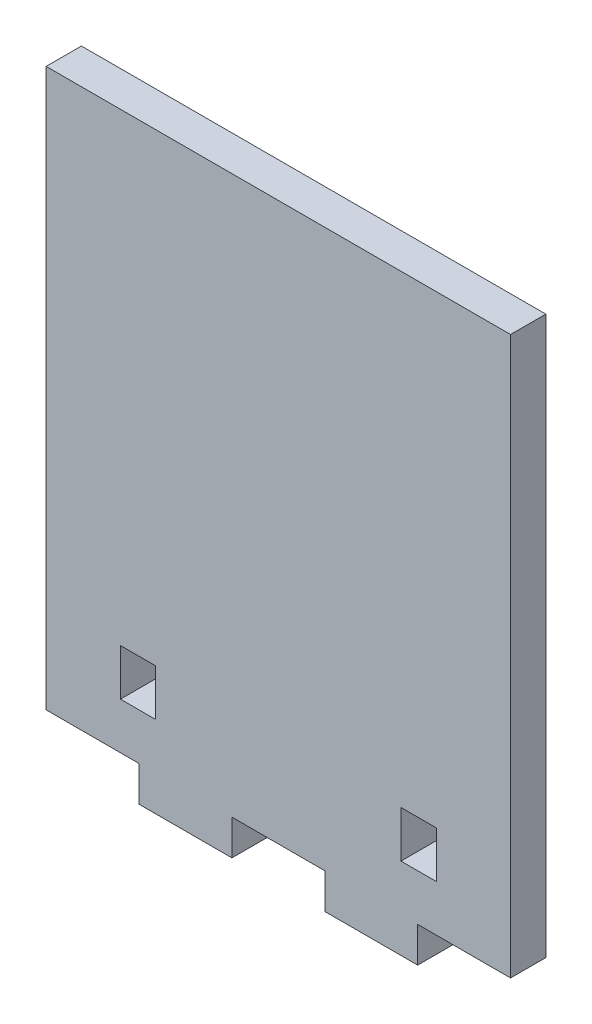
ISO-10303-21;
HEADER;
FILE_DESCRIPTION(('STEP AP214'),'2;1');
FILE_NAME('part.step','',(''),(''),'','','');
FILE_SCHEMA(('AUTOMOTIVE_DESIGN { 1 0 10303 214 1 1 1 1 }'));
ENDSEC;
DATA;
#1=APPLICATION_CONTEXT('core data for automotive mechanical design processes');
#2=APPLICATION_PROTOCOL_DEFINITION('international standard','automotive_design',2000,#1);
#3=PRODUCT_CONTEXT('',#1,'mechanical');
#4=PRODUCT('Part','Part','',(#3));
#5=PRODUCT_RELATED_PRODUCT_CATEGORY('part','',(#4));
#6=PRODUCT_DEFINITION_FORMATION('','',#4);
#7=PRODUCT_DEFINITION_CONTEXT('part definition',#1,'design');
#8=PRODUCT_DEFINITION('design','',#6,#7);
#9=PRODUCT_DEFINITION_SHAPE('','',#8);
#10=(LENGTH_UNIT() NAMED_UNIT(*) SI_UNIT(.MILLI.,.METRE.));
#11=(NAMED_UNIT(*) PLANE_ANGLE_UNIT() SI_UNIT($,.RADIAN.));
#12=(NAMED_UNIT(*) SI_UNIT($,.STERADIAN.) SOLID_ANGLE_UNIT());
#13=UNCERTAINTY_MEASURE_WITH_UNIT(LENGTH_MEASURE(1.E-05),#10,'distance_accuracy_value','');
#14=(GEOMETRIC_REPRESENTATION_CONTEXT(3) GLOBAL_UNCERTAINTY_ASSIGNED_CONTEXT((#13)) GLOBAL_UNIT_ASSIGNED_CONTEXT((#10,
#11,#12)) REPRESENTATION_CONTEXT('',''));
#15=CARTESIAN_POINT('',(0.,0.,0.));
#16=DIRECTION('',(0.,0.,1.));
#17=DIRECTION('',(1.,0.,0.));
#18=AXIS2_PLACEMENT_3D('',#15,#16,#17);
#19=CARTESIAN_POINT('',(0.,0.,4.826));
#20=DIRECTION('',(0.,1.,0.));
#21=DIRECTION('',(0.,0.,1.));
#22=AXIS2_PLACEMENT_3D('',#19,#20,#21);
#23=PLANE('',#22);
#24=DIRECTION('',(1.,0.,0.));
#25=VECTOR('',#24,1.);
#26=CARTESIAN_POINT('',(0.,0.,0.));
#27=LINE('',#26,#25);
#28=CARTESIAN_POINT('',(12.7,0.,0.));
#29=VERTEX_POINT('',#28);
#30=CARTESIAN_POINT('',(25.4,0.,0.));
#31=VERTEX_POINT('',#30);
#32=EDGE_CURVE('E313',#29,#31,#27,.T.);
#33=ORIENTED_EDGE('',*,*,#32,.T.);
#34=DIRECTION('',(0.,0.,1.));
#35=VECTOR('',#34,1.);
#36=CARTESIAN_POINT('',(25.4,0.,0.));
#37=LINE('',#36,#35);
#38=CARTESIAN_POINT('',(25.4,0.,4.826));
#39=VERTEX_POINT('',#38);
#40=EDGE_CURVE('E264',#31,#39,#37,.T.);
#41=ORIENTED_EDGE('',*,*,#40,.T.);
#42=DIRECTION('',(1.,0.,0.));
#43=VECTOR('',#42,1.);
#44=CARTESIAN_POINT('',(0.,0.,4.826));
#45=LINE('',#44,#43);
#46=CARTESIAN_POINT('',(12.7,0.,4.826));
#47=VERTEX_POINT('',#46);
#48=EDGE_CURVE('E303',#47,#39,#45,.T.);
#49=ORIENTED_EDGE('',*,*,#48,.F.);
#50=DIRECTION('',(0.,0.,1.));
#51=VECTOR('',#50,1.);
#52=CARTESIAN_POINT('',(12.7,0.,0.));
#53=LINE('',#52,#51);
#54=EDGE_CURVE('E287',#29,#47,#53,.T.);
#55=ORIENTED_EDGE('',*,*,#54,.F.);
#56=EDGE_LOOP('',(#33,#41,#49,#55));
#57=FACE_BOUND('',#56,.T.);
#58=ADVANCED_FACE('F33',(#57),#23,.F.);
#59=CARTESIAN_POINT('',(0.,0.,4.826));
#60=DIRECTION('',(1.,0.,0.));
#61=DIRECTION('',(0.,0.,-1.));
#62=AXIS2_PLACEMENT_3D('',#59,#60,#61);
#63=PLANE('',#62);
#64=DIRECTION('',(0.,-1.,0.));
#65=VECTOR('',#64,1.);
#66=CARTESIAN_POINT('',(0.,0.,0.));
#67=LINE('',#66,#65);
#68=CARTESIAN_POINT('',(0.,81.026,0.));
#69=VERTEX_POINT('',#68);
#70=CARTESIAN_POINT('',(0.,4.826,0.));
#71=VERTEX_POINT('',#70);
#72=EDGE_CURVE('E294',#69,#71,#67,.T.);
#73=ORIENTED_EDGE('',*,*,#72,.T.);
#74=DIRECTION('',(0.,0.,1.));
#75=VECTOR('',#74,1.);
#76=CARTESIAN_POINT('',(0.,4.826,0.));
#77=LINE('',#76,#75);
#78=CARTESIAN_POINT('',(0.,4.826,4.826));
#79=VERTEX_POINT('',#78);
#80=EDGE_CURVE('E291',#71,#79,#77,.T.);
#81=ORIENTED_EDGE('',*,*,#80,.T.);
#82=DIRECTION('',(0.,-1.,0.));
#83=VECTOR('',#82,1.);
#84=CARTESIAN_POINT('',(0.,0.,4.826));
#85=LINE('',#84,#83);
#86=CARTESIAN_POINT('',(0.,81.026,4.826));
#87=VERTEX_POINT('',#86);
#88=EDGE_CURVE('E298',#87,#79,#85,.T.);
#89=ORIENTED_EDGE('',*,*,#88,.F.);
#90=DIRECTION('',(0.,0.,-1.));
#91=VECTOR('',#90,1.);
#92=CARTESIAN_POINT('',(0.,81.026,4.826));
#93=LINE('',#92,#91);
#94=EDGE_CURVE('E41',#87,#69,#93,.T.);
#95=ORIENTED_EDGE('',*,*,#94,.T.);
#96=EDGE_LOOP('',(#73,#81,#89,#95));
#97=FACE_BOUND('',#96,.T.);
#98=ADVANCED_FACE('F35',(#97),#63,.F.);
#99=CARTESIAN_POINT('',(38.1,0.,0.));
#100=VERTEX_POINT('',#99);
#101=CARTESIAN_POINT('',(50.8,0.,0.));
#102=VERTEX_POINT('',#101);
#103=EDGE_CURVE('E312',#100,#102,#27,.T.);
#104=ORIENTED_EDGE('',*,*,#103,.T.);
#105=DIRECTION('',(0.,0.,1.));
#106=VECTOR('',#105,1.);
#107=CARTESIAN_POINT('',(50.8,0.,0.));
#108=LINE('',#107,#106);
#109=CARTESIAN_POINT('',(50.8,0.,4.826));
#110=VERTEX_POINT('',#109);
#111=EDGE_CURVE('E247',#102,#110,#108,.T.);
#112=ORIENTED_EDGE('',*,*,#111,.T.);
#113=CARTESIAN_POINT('',(38.1,0.,4.826));
#114=VERTEX_POINT('',#113);
#115=EDGE_CURVE('E301',#114,#110,#45,.T.);
#116=ORIENTED_EDGE('',*,*,#115,.F.);
#117=DIRECTION('',(0.,0.,1.));
#118=VECTOR('',#117,1.);
#119=CARTESIAN_POINT('',(38.1,0.,0.));
#120=LINE('',#119,#118);
#121=EDGE_CURVE('E276',#100,#114,#120,.T.);
#122=ORIENTED_EDGE('',*,*,#121,.F.);
#123=EDGE_LOOP('',(#104,#112,#116,#122));
#124=FACE_BOUND('',#123,.T.);
#125=ADVANCED_FACE('F358',(#124),#23,.F.);
#126=CARTESIAN_POINT('',(63.5,0.,4.826));
#127=DIRECTION('',(-1.,0.,0.));
#128=DIRECTION('',(0.,-1.,0.));
#129=AXIS2_PLACEMENT_3D('',#126,#127,#128);
#130=PLANE('',#129);
#131=DIRECTION('',(0.,1.,0.));
#132=VECTOR('',#131,1.);
#133=CARTESIAN_POINT('',(63.5,0.,4.826));
#134=LINE('',#133,#132);
#135=CARTESIAN_POINT('',(63.5,4.826,4.826));
#136=VERTEX_POINT('',#135);
#137=CARTESIAN_POINT('',(63.5,81.026,4.826));
#138=VERTEX_POINT('',#137);
#139=EDGE_CURVE('E306',#136,#138,#134,.T.);
#140=ORIENTED_EDGE('',*,*,#139,.F.);
#141=DIRECTION('',(0.,0.,1.));
#142=VECTOR('',#141,1.);
#143=CARTESIAN_POINT('',(63.5,4.826,0.));
#144=LINE('',#143,#142);
#145=CARTESIAN_POINT('',(63.5,4.826,0.));
#146=VERTEX_POINT('',#145);
#147=EDGE_CURVE('E243',#146,#136,#144,.T.);
#148=ORIENTED_EDGE('',*,*,#147,.F.);
#149=DIRECTION('',(0.,1.,0.));
#150=VECTOR('',#149,1.);
#151=CARTESIAN_POINT('',(63.5,0.,0.));
#152=LINE('',#151,#150);
#153=CARTESIAN_POINT('',(63.5,81.026,0.));
#154=VERTEX_POINT('',#153);
#155=EDGE_CURVE('E316',#146,#154,#152,.T.);
#156=ORIENTED_EDGE('',*,*,#155,.T.);
#157=DIRECTION('',(0.,0.,-1.));
#158=VECTOR('',#157,1.);
#159=CARTESIAN_POINT('',(63.5,81.026,4.826));
#160=LINE('',#159,#158);
#161=EDGE_CURVE('E11',#138,#154,#160,.T.);
#162=ORIENTED_EDGE('',*,*,#161,.F.);
#163=EDGE_LOOP('',(#140,#148,#156,#162));
#164=FACE_BOUND('',#163,.T.);
#165=ADVANCED_FACE('F346',(#164),#130,.F.);
#166=CARTESIAN_POINT('',(0.,81.026,4.826));
#167=DIRECTION('',(0.,-1.,0.));
#168=DIRECTION('',(0.,0.,-1.));
#169=AXIS2_PLACEMENT_3D('',#166,#167,#168);
#170=PLANE('',#169);
#171=DIRECTION('',(-1.,0.,0.));
#172=VECTOR('',#171,1.);
#173=CARTESIAN_POINT('',(0.,81.026,0.));
#174=LINE('',#173,#172);
#175=EDGE_CURVE('E302',#154,#69,#174,.T.);
#176=ORIENTED_EDGE('',*,*,#175,.T.);
#177=ORIENTED_EDGE('',*,*,#94,.F.);
#178=DIRECTION('',(-1.,0.,0.));
#179=VECTOR('',#178,1.);
#180=CARTESIAN_POINT('',(0.,81.026,4.826));
#181=LINE('',#180,#179);
#182=EDGE_CURVE('E308',#138,#87,#181,.T.);
#183=ORIENTED_EDGE('',*,*,#182,.F.);
#184=ORIENTED_EDGE('',*,*,#161,.T.);
#185=EDGE_LOOP('',(#176,#177,#183,#184));
#186=FACE_BOUND('',#185,.T.);
#187=ADVANCED_FACE('F344',(#186),#170,.F.);
#188=CARTESIAN_POINT('',(0.,0.,4.826));
#189=DIRECTION('',(0.,0.,-1.));
#190=DIRECTION('',(-1.,0.,0.));
#191=AXIS2_PLACEMENT_3D('',#188,#189,#190);
#192=PLANE('',#191);
#193=DIRECTION('',(-1.,0.,0.));
#194=VECTOR('',#193,1.);
#195=CARTESIAN_POINT('',(0.,17.526,4.826));
#196=LINE('',#195,#194);
#197=CARTESIAN_POINT('',(14.986,17.526,4.826));
#198=VERTEX_POINT('',#197);
#199=CARTESIAN_POINT('',(10.16,17.526,4.826));
#200=VERTEX_POINT('',#199);
#201=EDGE_CURVE('E175',#198,#200,#196,.T.);
#202=ORIENTED_EDGE('',*,*,#201,.F.);
#203=DIRECTION('',(0.,-1.,0.));
#204=VECTOR('',#203,1.);
#205=CARTESIAN_POINT('',(14.986,0.,4.826));
#206=LINE('',#205,#204);
#207=CARTESIAN_POINT('',(14.986,11.176,4.826));
#208=VERTEX_POINT('',#207);
#209=EDGE_CURVE('E172',#198,#208,#206,.T.);
#210=ORIENTED_EDGE('',*,*,#209,.T.);
#211=DIRECTION('',(-1.,0.,0.));
#212=VECTOR('',#211,1.);
#213=CARTESIAN_POINT('',(0.,11.176,4.826));
#214=LINE('',#213,#212);
#215=CARTESIAN_POINT('',(10.16,11.176,4.826));
#216=VERTEX_POINT('',#215);
#217=EDGE_CURVE('E178',#208,#216,#214,.T.);
#218=ORIENTED_EDGE('',*,*,#217,.T.);
#219=DIRECTION('',(0.,-1.,0.));
#220=VECTOR('',#219,1.);
#221=CARTESIAN_POINT('',(10.16,0.,4.826));
#222=LINE('',#221,#220);
#223=EDGE_CURVE('E182',#200,#216,#222,.T.);
#224=ORIENTED_EDGE('',*,*,#223,.F.);
#225=EDGE_LOOP('',(#202,#210,#218,#224));
#226=FACE_BOUND('',#225,.T.);
#227=DIRECTION('',(-1.,0.,0.));
#228=VECTOR('',#227,1.);
#229=CARTESIAN_POINT('',(0.,17.526,4.826));
#230=LINE('',#229,#228);
#231=CARTESIAN_POINT('',(53.34,17.526,4.826));
#232=VERTEX_POINT('',#231);
#233=CARTESIAN_POINT('',(48.514,17.526,4.826));
#234=VERTEX_POINT('',#233);
#235=EDGE_CURVE('E215',#232,#234,#230,.T.);
#236=ORIENTED_EDGE('',*,*,#235,.F.);
#237=DIRECTION('',(0.,-1.,0.));
#238=VECTOR('',#237,1.);
#239=CARTESIAN_POINT('',(53.34,0.,4.826));
#240=LINE('',#239,#238);
#241=CARTESIAN_POINT('',(53.34,11.176,4.826));
#242=VERTEX_POINT('',#241);
#243=EDGE_CURVE('E205',#232,#242,#240,.T.);
#244=ORIENTED_EDGE('',*,*,#243,.T.);
#245=DIRECTION('',(-1.,0.,0.));
#246=VECTOR('',#245,1.);
#247=CARTESIAN_POINT('',(0.,11.176,4.826));
#248=LINE('',#247,#246);
#249=CARTESIAN_POINT('',(48.514,11.176,4.826));
#250=VERTEX_POINT('',#249);
#251=EDGE_CURVE('E208',#242,#250,#248,.T.);
#252=ORIENTED_EDGE('',*,*,#251,.T.);
#253=DIRECTION('',(0.,-1.,0.));
#254=VECTOR('',#253,1.);
#255=CARTESIAN_POINT('',(48.514,0.,4.826));
#256=LINE('',#255,#254);
#257=EDGE_CURVE('E212',#234,#250,#256,.T.);
#258=ORIENTED_EDGE('',*,*,#257,.F.);
#259=EDGE_LOOP('',(#236,#244,#252,#258));
#260=FACE_BOUND('',#259,.T.);
#261=ORIENTED_EDGE('',*,*,#115,.T.);
#262=DIRECTION('',(0.,-1.,0.));
#263=VECTOR('',#262,1.);
#264=CARTESIAN_POINT('',(50.8,0.,4.826));
#265=LINE('',#264,#263);
#266=CARTESIAN_POINT('',(50.8,4.826,4.826));
#267=VERTEX_POINT('',#266);
#268=EDGE_CURVE('E240',#267,#110,#265,.T.);
#269=ORIENTED_EDGE('',*,*,#268,.F.);
#270=DIRECTION('',(-1.,0.,0.));
#271=VECTOR('',#270,1.);
#272=CARTESIAN_POINT('',(63.5,4.826,4.826));
#273=LINE('',#272,#271);
#274=EDGE_CURVE('E229',#136,#267,#273,.T.);
#275=ORIENTED_EDGE('',*,*,#274,.F.);
#276=ORIENTED_EDGE('',*,*,#139,.T.);
#277=ORIENTED_EDGE('',*,*,#182,.T.);
#278=ORIENTED_EDGE('',*,*,#88,.T.);
#279=DIRECTION('',(-1.,0.,0.));
#280=VECTOR('',#279,1.);
#281=CARTESIAN_POINT('',(0.,4.826,4.826));
#282=LINE('',#281,#280);
#283=CARTESIAN_POINT('',(12.7,4.826,4.826));
#284=VERTEX_POINT('',#283);
#285=EDGE_CURVE('E284',#284,#79,#282,.T.);
#286=ORIENTED_EDGE('',*,*,#285,.F.);
#287=DIRECTION('',(0.,1.,0.));
#288=VECTOR('',#287,1.);
#289=CARTESIAN_POINT('',(12.7,0.,4.826));
#290=LINE('',#289,#288);
#291=EDGE_CURVE('E273',#47,#284,#290,.T.);
#292=ORIENTED_EDGE('',*,*,#291,.F.);
#293=ORIENTED_EDGE('',*,*,#48,.T.);
#294=DIRECTION('',(0.,-1.,0.));
#295=VECTOR('',#294,1.);
#296=CARTESIAN_POINT('',(25.4,0.,4.826));
#297=LINE('',#296,#295);
#298=CARTESIAN_POINT('',(25.4,4.826,4.826));
#299=VERTEX_POINT('',#298);
#300=EDGE_CURVE('E250',#299,#39,#297,.T.);
#301=ORIENTED_EDGE('',*,*,#300,.F.);
#302=DIRECTION('',(-1.,0.,0.));
#303=VECTOR('',#302,1.);
#304=CARTESIAN_POINT('',(25.4,4.826,4.826));
#305=LINE('',#304,#303);
#306=CARTESIAN_POINT('',(38.1,4.826,4.826));
#307=VERTEX_POINT('',#306);
#308=EDGE_CURVE('E258',#307,#299,#305,.T.);
#309=ORIENTED_EDGE('',*,*,#308,.F.);
#310=DIRECTION('',(0.,1.,0.));
#311=VECTOR('',#310,1.);
#312=CARTESIAN_POINT('',(38.1,0.,4.826));
#313=LINE('',#312,#311);
#314=EDGE_CURVE('E266',#114,#307,#313,.T.);
#315=ORIENTED_EDGE('',*,*,#314,.F.);
#316=EDGE_LOOP('',(#261,#269,#275,#276,#277,#278,#286,#292,#293,#301,#309,#315));
#317=FACE_BOUND('',#316,.T.);
#318=ADVANCED_FACE('F184',(#226,#260,#317),#192,.F.);
#319=CARTESIAN_POINT('',(0.,0.,0.));
#320=DIRECTION('',(0.,0.,-1.));
#321=DIRECTION('',(-1.,0.,0.));
#322=AXIS2_PLACEMENT_3D('',#319,#320,#321);
#323=PLANE('',#322);
#324=DIRECTION('',(0.,-1.,0.));
#325=VECTOR('',#324,1.);
#326=CARTESIAN_POINT('',(14.986,0.,0.));
#327=LINE('',#326,#325);
#328=CARTESIAN_POINT('',(14.986,17.526,0.));
#329=VERTEX_POINT('',#328);
#330=CARTESIAN_POINT('',(14.986,11.176,0.));
#331=VERTEX_POINT('',#330);
#332=EDGE_CURVE('E56',#329,#331,#327,.T.);
#333=ORIENTED_EDGE('',*,*,#332,.F.);
#334=DIRECTION('',(-1.,0.,0.));
#335=VECTOR('',#334,1.);
#336=CARTESIAN_POINT('',(0.,17.526,0.));
#337=LINE('',#336,#335);
#338=CARTESIAN_POINT('',(10.16,17.526,0.));
#339=VERTEX_POINT('',#338);
#340=EDGE_CURVE('E186',#329,#339,#337,.T.);
#341=ORIENTED_EDGE('',*,*,#340,.T.);
#342=DIRECTION('',(0.,-1.,0.));
#343=VECTOR('',#342,1.);
#344=CARTESIAN_POINT('',(10.16,0.,0.));
#345=LINE('',#344,#343);
#346=CARTESIAN_POINT('',(10.16,11.176,0.));
#347=VERTEX_POINT('',#346);
#348=EDGE_CURVE('E189',#339,#347,#345,.T.);
#349=ORIENTED_EDGE('',*,*,#348,.T.);
#350=DIRECTION('',(-1.,0.,0.));
#351=VECTOR('',#350,1.);
#352=CARTESIAN_POINT('',(0.,11.176,0.));
#353=LINE('',#352,#351);
#354=EDGE_CURVE('E195',#331,#347,#353,.T.);
#355=ORIENTED_EDGE('',*,*,#354,.F.);
#356=EDGE_LOOP('',(#333,#341,#349,#355));
#357=FACE_BOUND('',#356,.T.);
#358=DIRECTION('',(0.,-1.,0.));
#359=VECTOR('',#358,1.);
#360=CARTESIAN_POINT('',(53.34,0.,0.));
#361=LINE('',#360,#359);
#362=CARTESIAN_POINT('',(53.34,17.526,0.));
#363=VERTEX_POINT('',#362);
#364=CARTESIAN_POINT('',(53.34,11.176,0.));
#365=VERTEX_POINT('',#364);
#366=EDGE_CURVE('E201',#363,#365,#361,.T.);
#367=ORIENTED_EDGE('',*,*,#366,.F.);
#368=DIRECTION('',(-1.,0.,0.));
#369=VECTOR('',#368,1.);
#370=CARTESIAN_POINT('',(0.,17.526,0.));
#371=LINE('',#370,#369);
#372=CARTESIAN_POINT('',(48.514,17.526,0.));
#373=VERTEX_POINT('',#372);
#374=EDGE_CURVE('E209',#363,#373,#371,.T.);
#375=ORIENTED_EDGE('',*,*,#374,.T.);
#376=DIRECTION('',(0.,-1.,0.));
#377=VECTOR('',#376,1.);
#378=CARTESIAN_POINT('',(48.514,0.,0.));
#379=LINE('',#378,#377);
#380=CARTESIAN_POINT('',(48.514,11.176,0.));
#381=VERTEX_POINT('',#380);
#382=EDGE_CURVE('E222',#373,#381,#379,.T.);
#383=ORIENTED_EDGE('',*,*,#382,.T.);
#384=DIRECTION('',(-1.,0.,0.));
#385=VECTOR('',#384,1.);
#386=CARTESIAN_POINT('',(0.,11.176,0.));
#387=LINE('',#386,#385);
#388=EDGE_CURVE('E219',#365,#381,#387,.T.);
#389=ORIENTED_EDGE('',*,*,#388,.F.);
#390=EDGE_LOOP('',(#367,#375,#383,#389));
#391=FACE_BOUND('',#390,.T.);
#392=DIRECTION('',(0.,-1.,0.));
#393=VECTOR('',#392,1.);
#394=CARTESIAN_POINT('',(50.8,0.,0.));
#395=LINE('',#394,#393);
#396=CARTESIAN_POINT('',(50.8,4.826,0.));
#397=VERTEX_POINT('',#396);
#398=EDGE_CURVE('E239',#397,#102,#395,.T.);
#399=ORIENTED_EDGE('',*,*,#398,.T.);
#400=ORIENTED_EDGE('',*,*,#103,.F.);
#401=DIRECTION('',(0.,1.,0.));
#402=VECTOR('',#401,1.);
#403=CARTESIAN_POINT('',(38.1,0.,0.));
#404=LINE('',#403,#402);
#405=CARTESIAN_POINT('',(38.1,4.826,0.));
#406=VERTEX_POINT('',#405);
#407=EDGE_CURVE('E257',#100,#406,#404,.T.);
#408=ORIENTED_EDGE('',*,*,#407,.T.);
#409=DIRECTION('',(-1.,0.,0.));
#410=VECTOR('',#409,1.);
#411=CARTESIAN_POINT('',(25.4,4.826,0.));
#412=LINE('',#411,#410);
#413=CARTESIAN_POINT('',(25.4,4.826,0.));
#414=VERTEX_POINT('',#413);
#415=EDGE_CURVE('E261',#406,#414,#412,.T.);
#416=ORIENTED_EDGE('',*,*,#415,.T.);
#417=DIRECTION('',(0.,-1.,0.));
#418=VECTOR('',#417,1.);
#419=CARTESIAN_POINT('',(25.4,0.,0.));
#420=LINE('',#419,#418);
#421=EDGE_CURVE('E254',#414,#31,#420,.T.);
#422=ORIENTED_EDGE('',*,*,#421,.T.);
#423=ORIENTED_EDGE('',*,*,#32,.F.);
#424=DIRECTION('',(0.,1.,0.));
#425=VECTOR('',#424,1.);
#426=CARTESIAN_POINT('',(12.7,0.,0.));
#427=LINE('',#426,#425);
#428=CARTESIAN_POINT('',(12.7,4.826,0.));
#429=VERTEX_POINT('',#428);
#430=EDGE_CURVE('E280',#29,#429,#427,.T.);
#431=ORIENTED_EDGE('',*,*,#430,.T.);
#432=DIRECTION('',(-1.,0.,0.));
#433=VECTOR('',#432,1.);
#434=CARTESIAN_POINT('',(0.,4.826,0.));
#435=LINE('',#434,#433);
#436=EDGE_CURVE('E283',#429,#71,#435,.T.);
#437=ORIENTED_EDGE('',*,*,#436,.T.);
#438=ORIENTED_EDGE('',*,*,#72,.F.);
#439=ORIENTED_EDGE('',*,*,#175,.F.);
#440=ORIENTED_EDGE('',*,*,#155,.F.);
#441=DIRECTION('',(-1.,0.,0.));
#442=VECTOR('',#441,1.);
#443=CARTESIAN_POINT('',(63.5,4.826,0.));
#444=LINE('',#443,#442);
#445=EDGE_CURVE('E236',#146,#397,#444,.T.);
#446=ORIENTED_EDGE('',*,*,#445,.T.);
#447=EDGE_LOOP('',(#399,#400,#408,#416,#422,#423,#431,#437,#438,#439,#440,#446));
#448=FACE_BOUND('',#447,.T.);
#449=ADVANCED_FACE('F327',(#357,#391,#448),#323,.T.);
#450=CARTESIAN_POINT('',(0.,4.826,0.));
#451=DIRECTION('',(0.,1.,0.));
#452=DIRECTION('',(-1.,0.,0.));
#453=AXIS2_PLACEMENT_3D('',#450,#451,#452);
#454=PLANE('',#453);
#455=ORIENTED_EDGE('',*,*,#285,.T.);
#456=ORIENTED_EDGE('',*,*,#80,.F.);
#457=ORIENTED_EDGE('',*,*,#436,.F.);
#458=DIRECTION('',(0.,0.,1.));
#459=VECTOR('',#458,1.);
#460=CARTESIAN_POINT('',(12.7,4.826,0.));
#461=LINE('',#460,#459);
#462=EDGE_CURVE('E295',#429,#284,#461,.T.);
#463=ORIENTED_EDGE('',*,*,#462,.T.);
#464=EDGE_LOOP('',(#455,#456,#457,#463));
#465=FACE_BOUND('',#464,.T.);
#466=ADVANCED_FACE('F332',(#465),#454,.F.);
#467=CARTESIAN_POINT('',(12.7,0.,0.));
#468=DIRECTION('',(1.,0.,0.));
#469=DIRECTION('',(0.,0.,-1.));
#470=AXIS2_PLACEMENT_3D('',#467,#468,#469);
#471=PLANE('',#470);
#472=ORIENTED_EDGE('',*,*,#291,.T.);
#473=ORIENTED_EDGE('',*,*,#462,.F.);
#474=ORIENTED_EDGE('',*,*,#430,.F.);
#475=ORIENTED_EDGE('',*,*,#54,.T.);
#476=EDGE_LOOP('',(#472,#473,#474,#475));
#477=FACE_BOUND('',#476,.T.);
#478=ADVANCED_FACE('F334',(#477),#471,.F.);
#479=CARTESIAN_POINT('',(25.4,0.,0.));
#480=DIRECTION('',(-1.,0.,0.));
#481=DIRECTION('',(0.,0.,1.));
#482=AXIS2_PLACEMENT_3D('',#479,#480,#481);
#483=PLANE('',#482);
#484=ORIENTED_EDGE('',*,*,#300,.T.);
#485=ORIENTED_EDGE('',*,*,#40,.F.);
#486=ORIENTED_EDGE('',*,*,#421,.F.);
#487=DIRECTION('',(0.,0.,1.));
#488=VECTOR('',#487,1.);
#489=CARTESIAN_POINT('',(25.4,4.826,0.));
#490=LINE('',#489,#488);
#491=EDGE_CURVE('E271',#414,#299,#490,.T.);
#492=ORIENTED_EDGE('',*,*,#491,.T.);
#493=EDGE_LOOP('',(#484,#485,#486,#492));
#494=FACE_BOUND('',#493,.T.);
#495=ADVANCED_FACE('F370',(#494),#483,.F.);
#496=CARTESIAN_POINT('',(25.4,4.826,0.));
#497=DIRECTION('',(0.,1.,0.));
#498=DIRECTION('',(-1.,0.,0.));
#499=AXIS2_PLACEMENT_3D('',#496,#497,#498);
#500=PLANE('',#499);
#501=ORIENTED_EDGE('',*,*,#308,.T.);
#502=ORIENTED_EDGE('',*,*,#491,.F.);
#503=ORIENTED_EDGE('',*,*,#415,.F.);
#504=DIRECTION('',(0.,0.,1.));
#505=VECTOR('',#504,1.);
#506=CARTESIAN_POINT('',(38.1,4.826,0.));
#507=LINE('',#506,#505);
#508=EDGE_CURVE('E274',#406,#307,#507,.T.);
#509=ORIENTED_EDGE('',*,*,#508,.T.);
#510=EDGE_LOOP('',(#501,#502,#503,#509));
#511=FACE_BOUND('',#510,.T.);
#512=ADVANCED_FACE('F368',(#511),#500,.F.);
#513=CARTESIAN_POINT('',(38.1,0.,0.));
#514=DIRECTION('',(1.,0.,0.));
#515=DIRECTION('',(0.,0.,-1.));
#516=AXIS2_PLACEMENT_3D('',#513,#514,#515);
#517=PLANE('',#516);
#518=ORIENTED_EDGE('',*,*,#314,.T.);
#519=ORIENTED_EDGE('',*,*,#508,.F.);
#520=ORIENTED_EDGE('',*,*,#407,.F.);
#521=ORIENTED_EDGE('',*,*,#121,.T.);
#522=EDGE_LOOP('',(#518,#519,#520,#521));
#523=FACE_BOUND('',#522,.T.);
#524=ADVANCED_FACE('F365',(#523),#517,.F.);
#525=CARTESIAN_POINT('',(50.8,0.,0.));
#526=DIRECTION('',(-1.,0.,0.));
#527=DIRECTION('',(0.,0.,1.));
#528=AXIS2_PLACEMENT_3D('',#525,#526,#527);
#529=PLANE('',#528);
#530=ORIENTED_EDGE('',*,*,#268,.T.);
#531=ORIENTED_EDGE('',*,*,#111,.F.);
#532=ORIENTED_EDGE('',*,*,#398,.F.);
#533=DIRECTION('',(0.,0.,1.));
#534=VECTOR('',#533,1.);
#535=CARTESIAN_POINT('',(50.8,4.826,0.));
#536=LINE('',#535,#534);
#537=EDGE_CURVE('E251',#397,#267,#536,.T.);
#538=ORIENTED_EDGE('',*,*,#537,.T.);
#539=EDGE_LOOP('',(#530,#531,#532,#538));
#540=FACE_BOUND('',#539,.T.);
#541=ADVANCED_FACE('F355',(#540),#529,.F.);
#542=CARTESIAN_POINT('',(63.5,4.826,0.));
#543=DIRECTION('',(0.,1.,0.));
#544=DIRECTION('',(-1.,0.,0.));
#545=AXIS2_PLACEMENT_3D('',#542,#543,#544);
#546=PLANE('',#545);
#547=ORIENTED_EDGE('',*,*,#274,.T.);
#548=ORIENTED_EDGE('',*,*,#537,.F.);
#549=ORIENTED_EDGE('',*,*,#445,.F.);
#550=ORIENTED_EDGE('',*,*,#147,.T.);
#551=EDGE_LOOP('',(#547,#548,#549,#550));
#552=FACE_BOUND('',#551,.T.);
#553=ADVANCED_FACE('F352',(#552),#546,.F.);
#554=CARTESIAN_POINT('',(53.34,0.,4.826));
#555=DIRECTION('',(1.,0.,0.));
#556=DIRECTION('',(0.,1.,0.));
#557=AXIS2_PLACEMENT_3D('',#554,#555,#556);
#558=PLANE('',#557);
#559=ORIENTED_EDGE('',*,*,#366,.T.);
#560=DIRECTION('',(0.,0.,-1.));
#561=VECTOR('',#560,1.);
#562=CARTESIAN_POINT('',(53.34,11.176,4.826));
#563=LINE('',#562,#561);
#564=EDGE_CURVE('E217',#242,#365,#563,.T.);
#565=ORIENTED_EDGE('',*,*,#564,.F.);
#566=ORIENTED_EDGE('',*,*,#243,.F.);
#567=DIRECTION('',(0.,0.,-1.));
#568=VECTOR('',#567,1.);
#569=CARTESIAN_POINT('',(53.34,17.526,4.826));
#570=LINE('',#569,#568);
#571=EDGE_CURVE('E227',#232,#363,#570,.T.);
#572=ORIENTED_EDGE('',*,*,#571,.T.);
#573=EDGE_LOOP('',(#559,#565,#566,#572));
#574=FACE_BOUND('',#573,.T.);
#575=ADVANCED_FACE('F403',(#574),#558,.F.);
#576=CARTESIAN_POINT('',(0.,17.526,4.826));
#577=DIRECTION('',(0.,-1.,0.));
#578=DIRECTION('',(0.,0.,-1.));
#579=AXIS2_PLACEMENT_3D('',#576,#577,#578);
#580=PLANE('',#579);
#581=ORIENTED_EDGE('',*,*,#374,.F.);
#582=ORIENTED_EDGE('',*,*,#571,.F.);
#583=ORIENTED_EDGE('',*,*,#235,.T.);
#584=DIRECTION('',(0.,0.,-1.));
#585=VECTOR('',#584,1.);
#586=CARTESIAN_POINT('',(48.514,17.526,4.826));
#587=LINE('',#586,#585);
#588=EDGE_CURVE('E230',#234,#373,#587,.T.);
#589=ORIENTED_EDGE('',*,*,#588,.T.);
#590=EDGE_LOOP('',(#581,#582,#583,#589));
#591=FACE_BOUND('',#590,.T.);
#592=ADVANCED_FACE('F408',(#591),#580,.T.);
#593=CARTESIAN_POINT('',(48.514,0.,4.826));
#594=DIRECTION('',(1.,0.,0.));
#595=DIRECTION('',(0.,0.,-1.));
#596=AXIS2_PLACEMENT_3D('',#593,#594,#595);
#597=PLANE('',#596);
#598=ORIENTED_EDGE('',*,*,#382,.F.);
#599=ORIENTED_EDGE('',*,*,#588,.F.);
#600=ORIENTED_EDGE('',*,*,#257,.T.);
#601=DIRECTION('',(0.,0.,-1.));
#602=VECTOR('',#601,1.);
#603=CARTESIAN_POINT('',(48.514,11.176,4.826));
#604=LINE('',#603,#602);
#605=EDGE_CURVE('E232',#250,#381,#604,.T.);
#606=ORIENTED_EDGE('',*,*,#605,.T.);
#607=EDGE_LOOP('',(#598,#599,#600,#606));
#608=FACE_BOUND('',#607,.T.);
#609=ADVANCED_FACE('F413',(#608),#597,.T.);
#610=CARTESIAN_POINT('',(0.,11.176,4.826));
#611=DIRECTION('',(0.,-1.,0.));
#612=DIRECTION('',(1.,0.,0.));
#613=AXIS2_PLACEMENT_3D('',#610,#611,#612);
#614=PLANE('',#613);
#615=ORIENTED_EDGE('',*,*,#388,.T.);
#616=ORIENTED_EDGE('',*,*,#605,.F.);
#617=ORIENTED_EDGE('',*,*,#251,.F.);
#618=ORIENTED_EDGE('',*,*,#564,.T.);
#619=EDGE_LOOP('',(#615,#616,#617,#618));
#620=FACE_BOUND('',#619,.T.);
#621=ADVANCED_FACE('F410',(#620),#614,.F.);
#622=CARTESIAN_POINT('',(14.986,0.,4.826));
#623=DIRECTION('',(1.,0.,0.));
#624=DIRECTION('',(0.,0.,-1.));
#625=AXIS2_PLACEMENT_3D('',#622,#623,#624);
#626=PLANE('',#625);
#627=ORIENTED_EDGE('',*,*,#332,.T.);
#628=DIRECTION('',(0.,0.,-1.));
#629=VECTOR('',#628,1.);
#630=CARTESIAN_POINT('',(14.986,11.176,4.826));
#631=LINE('',#630,#629);
#632=EDGE_CURVE('E169',#208,#331,#631,.T.);
#633=ORIENTED_EDGE('',*,*,#632,.F.);
#634=ORIENTED_EDGE('',*,*,#209,.F.);
#635=DIRECTION('',(0.,0.,-1.));
#636=VECTOR('',#635,1.);
#637=CARTESIAN_POINT('',(14.986,17.526,4.826));
#638=LINE('',#637,#636);
#639=EDGE_CURVE('E199',#198,#329,#638,.T.);
#640=ORIENTED_EDGE('',*,*,#639,.T.);
#641=EDGE_LOOP('',(#627,#633,#634,#640));
#642=FACE_BOUND('',#641,.T.);
#643=ADVANCED_FACE('F170',(#642),#626,.F.);
#644=CARTESIAN_POINT('',(0.,17.526,4.826));
#645=DIRECTION('',(0.,-1.,0.));
#646=DIRECTION('',(0.,0.,-1.));
#647=AXIS2_PLACEMENT_3D('',#644,#645,#646);
#648=PLANE('',#647);
#649=ORIENTED_EDGE('',*,*,#340,.F.);
#650=ORIENTED_EDGE('',*,*,#639,.F.);
#651=ORIENTED_EDGE('',*,*,#201,.T.);
#652=DIRECTION('',(0.,0.,-1.));
#653=VECTOR('',#652,1.);
#654=CARTESIAN_POINT('',(10.16,17.526,4.826));
#655=LINE('',#654,#653);
#656=EDGE_CURVE('E202',#200,#339,#655,.T.);
#657=ORIENTED_EDGE('',*,*,#656,.T.);
#658=EDGE_LOOP('',(#649,#650,#651,#657));
#659=FACE_BOUND('',#658,.T.);
#660=ADVANCED_FACE('F423',(#659),#648,.T.);
#661=CARTESIAN_POINT('',(10.16,0.,4.826));
#662=DIRECTION('',(1.,0.,0.));
#663=DIRECTION('',(0.,0.,-1.));
#664=AXIS2_PLACEMENT_3D('',#661,#662,#663);
#665=PLANE('',#664);
#666=ORIENTED_EDGE('',*,*,#348,.F.);
#667=ORIENTED_EDGE('',*,*,#656,.F.);
#668=ORIENTED_EDGE('',*,*,#223,.T.);
#669=DIRECTION('',(0.,0.,-1.));
#670=VECTOR('',#669,1.);
#671=CARTESIAN_POINT('',(10.16,11.176,4.826));
#672=LINE('',#671,#670);
#673=EDGE_CURVE('E48',#216,#347,#672,.T.);
#674=ORIENTED_EDGE('',*,*,#673,.T.);
#675=EDGE_LOOP('',(#666,#667,#668,#674));
#676=FACE_BOUND('',#675,.T.);
#677=ADVANCED_FACE('F426',(#676),#665,.T.);
#678=CARTESIAN_POINT('',(0.,11.176,4.826));
#679=DIRECTION('',(0.,-1.,0.));
#680=DIRECTION('',(1.,0.,0.));
#681=AXIS2_PLACEMENT_3D('',#678,#679,#680);
#682=PLANE('',#681);
#683=ORIENTED_EDGE('',*,*,#354,.T.);
#684=ORIENTED_EDGE('',*,*,#673,.F.);
#685=ORIENTED_EDGE('',*,*,#217,.F.);
#686=ORIENTED_EDGE('',*,*,#632,.T.);
#687=EDGE_LOOP('',(#683,#684,#685,#686));
#688=FACE_BOUND('',#687,.T.);
#689=ADVANCED_FACE('F179',(#688),#682,.F.);
#690=CLOSED_SHELL('',(#58,#98,#125,#165,#187,#318,#449,#466,#478,#495,#512,#524,#541,#553,#575,
#592,#609,#621,#643,#660,#677,#689));
#691=MANIFOLD_SOLID_BREP('B2',#690);
#692=ADVANCED_BREP_SHAPE_REPRESENTATION('',(#18,#691),#14);
#693=SHAPE_DEFINITION_REPRESENTATION(#9,#692);
ENDSEC;
END-ISO-10303-21;
